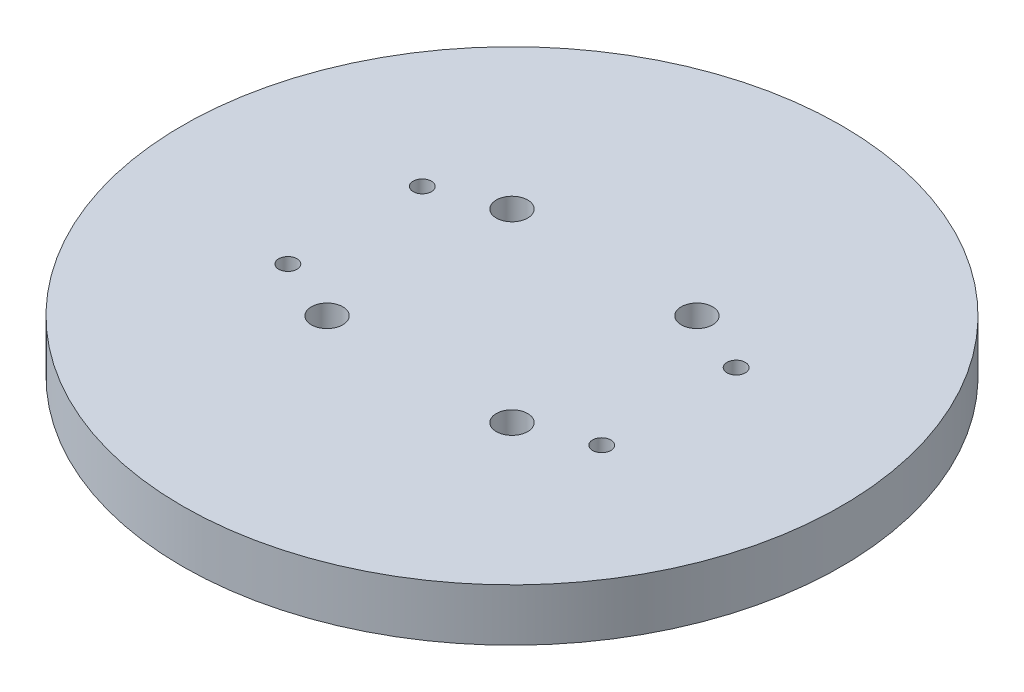
ISO-10303-21;
HEADER;
FILE_DESCRIPTION(('STEP AP214'),'2;1');
FILE_NAME('part.step','',(''),(''),'','','');
FILE_SCHEMA(('AUTOMOTIVE_DESIGN { 1 0 10303 214 1 1 1 1 }'));
ENDSEC;
DATA;
#1=APPLICATION_CONTEXT('core data for automotive mechanical design processes');
#2=APPLICATION_PROTOCOL_DEFINITION('international standard','automotive_design',2000,#1);
#3=PRODUCT_CONTEXT('',#1,'mechanical');
#4=PRODUCT('Part','Part','',(#3));
#5=PRODUCT_RELATED_PRODUCT_CATEGORY('part','',(#4));
#6=PRODUCT_DEFINITION_FORMATION('','',#4);
#7=PRODUCT_DEFINITION_CONTEXT('part definition',#1,'design');
#8=PRODUCT_DEFINITION('design','',#6,#7);
#9=PRODUCT_DEFINITION_SHAPE('','',#8);
#10=(LENGTH_UNIT() NAMED_UNIT(*) SI_UNIT(.MILLI.,.METRE.));
#11=(NAMED_UNIT(*) PLANE_ANGLE_UNIT() SI_UNIT($,.RADIAN.));
#12=(NAMED_UNIT(*) SI_UNIT($,.STERADIAN.) SOLID_ANGLE_UNIT());
#13=UNCERTAINTY_MEASURE_WITH_UNIT(LENGTH_MEASURE(1.E-05),#10,'distance_accuracy_value','');
#14=(GEOMETRIC_REPRESENTATION_CONTEXT(3) GLOBAL_UNCERTAINTY_ASSIGNED_CONTEXT((#13)) GLOBAL_UNIT_ASSIGNED_CONTEXT((#10,
#11,#12)) REPRESENTATION_CONTEXT('',''));
#15=CARTESIAN_POINT('',(0.,0.,0.));
#16=DIRECTION('',(0.,0.,1.));
#17=DIRECTION('',(1.,0.,0.));
#18=AXIS2_PLACEMENT_3D('',#15,#16,#17);
#19=CARTESIAN_POINT('',(0.,0.,-43.));
#20=DIRECTION('',(0.,1.,0.));
#21=DIRECTION('',(0.,0.,1.));
#22=AXIS2_PLACEMENT_3D('',#19,#20,#21);
#23=PLANE('',#22);
#24=CARTESIAN_POINT('',(17.6776695296638,0.,2.32233047033646));
#25=DIRECTION('',(0.,1.,0.));
#26=DIRECTION('',(0.,0.,1.));
#27=AXIS2_PLACEMENT_3D('',#24,#25,#26);
#28=CIRCLE('',#27,3.);
#29=CARTESIAN_POINT('',(17.6776695296638,0.,5.32233047033646));
#30=VERTEX_POINT('',#29);
#31=EDGE_CURVE('E222',#30,#30,#28,.T.);
#32=ORIENTED_EDGE('',*,*,#31,.F.);
#33=EDGE_LOOP('',(#32));
#34=FACE_BOUND('',#33,.T.);
#35=CARTESIAN_POINT('',(-17.6776695296636,0.,2.32233047033621));
#36=DIRECTION('',(0.,1.,0.));
#37=DIRECTION('',(0.,0.,1.));
#38=AXIS2_PLACEMENT_3D('',#35,#36,#37);
#39=CIRCLE('',#38,3.);
#40=CARTESIAN_POINT('',(-17.6776695296636,0.,5.32233047033621));
#41=VERTEX_POINT('',#40);
#42=EDGE_CURVE('E225',#41,#41,#39,.T.);
#43=ORIENTED_EDGE('',*,*,#42,.F.);
#44=EDGE_LOOP('',(#43));
#45=FACE_BOUND('',#44,.T.);
#46=CARTESIAN_POINT('',(-17.6776695296637,0.,37.6776695296637));
#47=DIRECTION('',(0.,1.,0.));
#48=DIRECTION('',(0.,0.,1.));
#49=AXIS2_PLACEMENT_3D('',#46,#47,#48);
#50=CIRCLE('',#49,3.);
#51=CARTESIAN_POINT('',(-17.6776695296637,0.,40.6776695296637));
#52=VERTEX_POINT('',#51);
#53=EDGE_CURVE('E87',#52,#52,#50,.T.);
#54=ORIENTED_EDGE('',*,*,#53,.F.);
#55=EDGE_LOOP('',(#54));
#56=FACE_BOUND('',#55,.T.);
#57=CARTESIAN_POINT('',(17.6776695296637,0.,37.6776695296637));
#58=DIRECTION('',(0.,1.,0.));
#59=DIRECTION('',(0.,0.,1.));
#60=AXIS2_PLACEMENT_3D('',#57,#58,#59);
#61=CIRCLE('',#60,3.);
#62=CARTESIAN_POINT('',(17.6776695296637,0.,40.6776695296637));
#63=VERTEX_POINT('',#62);
#64=EDGE_CURVE('E82',#63,#63,#61,.T.);
#65=ORIENTED_EDGE('',*,*,#64,.F.);
#66=EDGE_LOOP('',(#65));
#67=FACE_BOUND('',#66,.T.);
#68=CARTESIAN_POINT('',(-30.,0.,32.85));
#69=DIRECTION('',(0.,1.,0.));
#70=DIRECTION('',(0.,0.,1.));
#71=AXIS2_PLACEMENT_3D('',#68,#69,#70);
#72=CIRCLE('',#71,1.75);
#73=CARTESIAN_POINT('',(-30.,0.,34.6));
#74=VERTEX_POINT('',#73);
#75=EDGE_CURVE('E68',#74,#74,#72,.F.);
#76=ORIENTED_EDGE('',*,*,#75,.T.);
#77=EDGE_LOOP('',(#76));
#78=FACE_BOUND('',#77,.T.);
#79=CARTESIAN_POINT('',(30.,0.,7.15));
#80=DIRECTION('',(0.,1.,0.));
#81=DIRECTION('',(0.,0.,1.));
#82=AXIS2_PLACEMENT_3D('',#79,#80,#81);
#83=CIRCLE('',#82,1.75);
#84=CARTESIAN_POINT('',(30.,0.,8.9));
#85=VERTEX_POINT('',#84);
#86=EDGE_CURVE('E73',#85,#85,#83,.F.);
#87=ORIENTED_EDGE('',*,*,#86,.T.);
#88=EDGE_LOOP('',(#87));
#89=FACE_BOUND('',#88,.T.);
#90=CARTESIAN_POINT('',(-30.,0.,7.15));
#91=DIRECTION('',(0.,1.,0.));
#92=DIRECTION('',(0.,0.,1.));
#93=AXIS2_PLACEMENT_3D('',#90,#91,#92);
#94=CIRCLE('',#93,1.75);
#95=CARTESIAN_POINT('',(-30.,0.,8.9));
#96=VERTEX_POINT('',#95);
#97=EDGE_CURVE('E47',#96,#96,#94,.F.);
#98=ORIENTED_EDGE('',*,*,#97,.T.);
#99=EDGE_LOOP('',(#98));
#100=FACE_BOUND('',#99,.T.);
#101=CARTESIAN_POINT('',(30.,0.,32.85));
#102=DIRECTION('',(0.,1.,0.));
#103=DIRECTION('',(0.,0.,1.));
#104=AXIS2_PLACEMENT_3D('',#101,#102,#103);
#105=CIRCLE('',#104,1.75);
#106=CARTESIAN_POINT('',(30.,0.,34.6));
#107=VERTEX_POINT('',#106);
#108=EDGE_CURVE('E71',#107,#107,#105,.F.);
#109=ORIENTED_EDGE('',*,*,#108,.T.);
#110=EDGE_LOOP('',(#109));
#111=FACE_BOUND('',#110,.T.);
#112=CARTESIAN_POINT('',(0.,0.,20.));
#113=DIRECTION('',(0.,-1.,0.));
#114=DIRECTION('',(0.,0.,-1.));
#115=AXIS2_PLACEMENT_3D('',#112,#113,#114);
#116=CIRCLE('',#115,63.);
#117=CARTESIAN_POINT('',(0.,0.,-43.));
#118=VERTEX_POINT('',#117);
#119=EDGE_CURVE('E67',#118,#118,#116,.T.);
#120=ORIENTED_EDGE('',*,*,#119,.F.);
#121=EDGE_LOOP('',(#120));
#122=FACE_BOUND('',#121,.T.);
#123=ADVANCED_FACE('F43',(#34,#45,#56,#67,#78,#89,#100,#111,#122),#23,.T.);
#124=CARTESIAN_POINT('',(0.,-10.,20.));
#125=DIRECTION('',(0.,-1.,0.));
#126=DIRECTION('',(0.,0.,-1.));
#127=AXIS2_PLACEMENT_3D('',#124,#125,#126);
#128=PLANE('',#127);
#129=CARTESIAN_POINT('',(17.6776695296638,-10.,2.32233047033646));
#130=DIRECTION('',(0.,1.,0.));
#131=DIRECTION('',(0.,0.,1.));
#132=AXIS2_PLACEMENT_3D('',#129,#130,#131);
#133=CIRCLE('',#132,3.);
#134=CARTESIAN_POINT('',(17.6776695296638,-10.,5.32233047033646));
#135=VERTEX_POINT('',#134);
#136=EDGE_CURVE('E90',#135,#135,#133,.T.);
#137=ORIENTED_EDGE('',*,*,#136,.T.);
#138=EDGE_LOOP('',(#137));
#139=FACE_BOUND('',#138,.T.);
#140=CARTESIAN_POINT('',(-17.6776695296636,-10.,2.32233047033621));
#141=DIRECTION('',(0.,1.,0.));
#142=DIRECTION('',(0.,0.,1.));
#143=AXIS2_PLACEMENT_3D('',#140,#141,#142);
#144=CIRCLE('',#143,3.);
#145=CARTESIAN_POINT('',(-17.6776695296636,-10.,5.32233047033621));
#146=VERTEX_POINT('',#145);
#147=EDGE_CURVE('E223',#146,#146,#144,.T.);
#148=ORIENTED_EDGE('',*,*,#147,.T.);
#149=EDGE_LOOP('',(#148));
#150=FACE_BOUND('',#149,.T.);
#151=CARTESIAN_POINT('',(-17.6776695296637,-10.,37.6776695296637));
#152=DIRECTION('',(0.,1.,0.));
#153=DIRECTION('',(0.,0.,1.));
#154=AXIS2_PLACEMENT_3D('',#151,#152,#153);
#155=CIRCLE('',#154,3.);
#156=CARTESIAN_POINT('',(-17.6776695296637,-10.,40.6776695296637));
#157=VERTEX_POINT('',#156);
#158=EDGE_CURVE('E230',#157,#157,#155,.T.);
#159=ORIENTED_EDGE('',*,*,#158,.T.);
#160=EDGE_LOOP('',(#159));
#161=FACE_BOUND('',#160,.T.);
#162=CARTESIAN_POINT('',(17.6776695296637,-10.,37.6776695296637));
#163=DIRECTION('',(0.,1.,0.));
#164=DIRECTION('',(0.,0.,1.));
#165=AXIS2_PLACEMENT_3D('',#162,#163,#164);
#166=CIRCLE('',#165,3.);
#167=CARTESIAN_POINT('',(17.6776695296637,-10.,40.6776695296637));
#168=VERTEX_POINT('',#167);
#169=EDGE_CURVE('E78',#168,#168,#166,.T.);
#170=ORIENTED_EDGE('',*,*,#169,.T.);
#171=EDGE_LOOP('',(#170));
#172=FACE_BOUND('',#171,.T.);
#173=CARTESIAN_POINT('',(-30.,-10.,7.15));
#174=DIRECTION('',(0.,-1.,0.));
#175=DIRECTION('',(0.,0.,1.));
#176=AXIS2_PLACEMENT_3D('',#173,#174,#175);
#177=CIRCLE('',#176,1.75);
#178=CARTESIAN_POINT('',(-30.,-10.,8.9));
#179=VERTEX_POINT('',#178);
#180=EDGE_CURVE('E10',#179,#179,#177,.T.);
#181=ORIENTED_EDGE('',*,*,#180,.F.);
#182=EDGE_LOOP('',(#181));
#183=FACE_BOUND('',#182,.T.);
#184=CARTESIAN_POINT('',(30.,-10.,7.15));
#185=DIRECTION('',(0.,-1.,0.));
#186=DIRECTION('',(0.,0.,-1.));
#187=AXIS2_PLACEMENT_3D('',#184,#185,#186);
#188=CIRCLE('',#187,1.75);
#189=CARTESIAN_POINT('',(30.,-10.,5.39999999999999));
#190=VERTEX_POINT('',#189);
#191=EDGE_CURVE('E51',#190,#190,#188,.T.);
#192=ORIENTED_EDGE('',*,*,#191,.F.);
#193=EDGE_LOOP('',(#192));
#194=FACE_BOUND('',#193,.T.);
#195=CARTESIAN_POINT('',(30.,-10.,32.85));
#196=DIRECTION('',(0.,-1.,0.));
#197=DIRECTION('',(0.,0.,1.));
#198=AXIS2_PLACEMENT_3D('',#195,#196,#197);
#199=CIRCLE('',#198,1.75);
#200=CARTESIAN_POINT('',(30.,-10.,34.6));
#201=VERTEX_POINT('',#200);
#202=EDGE_CURVE('E56',#201,#201,#199,.T.);
#203=ORIENTED_EDGE('',*,*,#202,.F.);
#204=EDGE_LOOP('',(#203));
#205=FACE_BOUND('',#204,.T.);
#206=CARTESIAN_POINT('',(-30.,-10.,32.85));
#207=DIRECTION('',(0.,-1.,0.));
#208=DIRECTION('',(0.,0.,-1.));
#209=AXIS2_PLACEMENT_3D('',#206,#207,#208);
#210=CIRCLE('',#209,1.75);
#211=CARTESIAN_POINT('',(-30.,-10.,31.1));
#212=VERTEX_POINT('',#211);
#213=EDGE_CURVE('E64',#212,#212,#210,.T.);
#214=ORIENTED_EDGE('',*,*,#213,.F.);
#215=EDGE_LOOP('',(#214));
#216=FACE_BOUND('',#215,.T.);
#217=CARTESIAN_POINT('',(0.,-10.,20.));
#218=DIRECTION('',(0.,-1.,0.));
#219=DIRECTION('',(0.,0.,-1.));
#220=AXIS2_PLACEMENT_3D('',#217,#218,#219);
#221=CIRCLE('',#220,63.);
#222=CARTESIAN_POINT('',(0.,-10.,-43.));
#223=VERTEX_POINT('',#222);
#224=EDGE_CURVE('E59',#223,#223,#221,.T.);
#225=ORIENTED_EDGE('',*,*,#224,.T.);
#226=EDGE_LOOP('',(#225));
#227=FACE_BOUND('',#226,.T.);
#228=ADVANCED_FACE('F98',(#139,#150,#161,#172,#183,#194,#205,#216,#227),#128,.T.);
#229=CARTESIAN_POINT('',(0.,-10.,20.));
#230=DIRECTION('',(0.,1.,0.));
#231=DIRECTION('',(0.,0.,1.));
#232=AXIS2_PLACEMENT_3D('',#229,#230,#231);
#233=CYLINDRICAL_SURFACE('',#232,63.);
#234=ORIENTED_EDGE('',*,*,#224,.F.);
#235=EDGE_LOOP('',(#234));
#236=FACE_BOUND('',#235,.T.);
#237=ORIENTED_EDGE('',*,*,#119,.T.);
#238=EDGE_LOOP('',(#237));
#239=FACE_BOUND('',#238,.T.);
#240=ADVANCED_FACE('F100',(#236,#239),#233,.T.);
#241=CARTESIAN_POINT('',(-30.,14.307738994866,32.85));
#242=DIRECTION('',(0.,-1.,0.));
#243=DIRECTION('',(0.,0.,-1.));
#244=AXIS2_PLACEMENT_3D('',#241,#242,#243);
#245=CYLINDRICAL_SURFACE('',#244,1.75);
#246=ORIENTED_EDGE('',*,*,#213,.T.);
#247=EDGE_LOOP('',(#246));
#248=FACE_BOUND('',#247,.T.);
#249=ORIENTED_EDGE('',*,*,#75,.F.);
#250=EDGE_LOOP('',(#249));
#251=FACE_BOUND('',#250,.T.);
#252=ADVANCED_FACE('F45',(#248,#251),#245,.F.);
#253=CARTESIAN_POINT('',(30.,14.307738994866,32.85));
#254=DIRECTION('',(0.,-1.,0.));
#255=DIRECTION('',(0.,0.,-1.));
#256=AXIS2_PLACEMENT_3D('',#253,#254,#255);
#257=CYLINDRICAL_SURFACE('',#256,1.75);
#258=ORIENTED_EDGE('',*,*,#202,.T.);
#259=EDGE_LOOP('',(#258));
#260=FACE_BOUND('',#259,.T.);
#261=ORIENTED_EDGE('',*,*,#108,.F.);
#262=EDGE_LOOP('',(#261));
#263=FACE_BOUND('',#262,.T.);
#264=ADVANCED_FACE('F106',(#260,#263),#257,.F.);
#265=CARTESIAN_POINT('',(30.,14.307738994866,7.15));
#266=DIRECTION('',(0.,-1.,0.));
#267=DIRECTION('',(0.,0.,-1.));
#268=AXIS2_PLACEMENT_3D('',#265,#266,#267);
#269=CYLINDRICAL_SURFACE('',#268,1.75);
#270=ORIENTED_EDGE('',*,*,#191,.T.);
#271=EDGE_LOOP('',(#270));
#272=FACE_BOUND('',#271,.T.);
#273=ORIENTED_EDGE('',*,*,#86,.F.);
#274=EDGE_LOOP('',(#273));
#275=FACE_BOUND('',#274,.T.);
#276=ADVANCED_FACE('F121',(#272,#275),#269,.F.);
#277=CARTESIAN_POINT('',(-30.,14.307738994866,7.15));
#278=DIRECTION('',(0.,-1.,0.));
#279=DIRECTION('',(0.,0.,-1.));
#280=AXIS2_PLACEMENT_3D('',#277,#278,#279);
#281=CYLINDRICAL_SURFACE('',#280,1.75);
#282=ORIENTED_EDGE('',*,*,#180,.T.);
#283=EDGE_LOOP('',(#282));
#284=FACE_BOUND('',#283,.T.);
#285=ORIENTED_EDGE('',*,*,#97,.F.);
#286=EDGE_LOOP('',(#285));
#287=FACE_BOUND('',#286,.T.);
#288=ADVANCED_FACE('F118',(#284,#287),#281,.F.);
#289=CARTESIAN_POINT('',(17.6776695296637,-10.,37.6776695296637));
#290=DIRECTION('',(0.,1.,0.));
#291=DIRECTION('',(0.,0.,1.));
#292=AXIS2_PLACEMENT_3D('',#289,#290,#291);
#293=CYLINDRICAL_SURFACE('',#292,3.);
#294=ORIENTED_EDGE('',*,*,#169,.F.);
#295=EDGE_LOOP('',(#294));
#296=FACE_BOUND('',#295,.T.);
#297=ORIENTED_EDGE('',*,*,#64,.T.);
#298=EDGE_LOOP('',(#297));
#299=FACE_BOUND('',#298,.T.);
#300=ADVANCED_FACE('F112',(#296,#299),#293,.F.);
#301=CARTESIAN_POINT('',(-17.6776695296637,-10.,37.6776695296637));
#302=DIRECTION('',(0.,1.,0.));
#303=DIRECTION('',(0.,0.,1.));
#304=AXIS2_PLACEMENT_3D('',#301,#302,#303);
#305=CYLINDRICAL_SURFACE('',#304,3.);
#306=ORIENTED_EDGE('',*,*,#158,.F.);
#307=EDGE_LOOP('',(#306));
#308=FACE_BOUND('',#307,.T.);
#309=ORIENTED_EDGE('',*,*,#53,.T.);
#310=EDGE_LOOP('',(#309));
#311=FACE_BOUND('',#310,.T.);
#312=ADVANCED_FACE('F168',(#308,#311),#305,.F.);
#313=CARTESIAN_POINT('',(-17.6776695296636,-10.,2.32233047033621));
#314=DIRECTION('',(0.,1.,0.));
#315=DIRECTION('',(0.,0.,1.));
#316=AXIS2_PLACEMENT_3D('',#313,#314,#315);
#317=CYLINDRICAL_SURFACE('',#316,3.);
#318=ORIENTED_EDGE('',*,*,#147,.F.);
#319=EDGE_LOOP('',(#318));
#320=FACE_BOUND('',#319,.T.);
#321=ORIENTED_EDGE('',*,*,#42,.T.);
#322=EDGE_LOOP('',(#321));
#323=FACE_BOUND('',#322,.T.);
#324=ADVANCED_FACE('F176',(#320,#323),#317,.F.);
#325=CARTESIAN_POINT('',(17.6776695296638,-10.,2.32233047033646));
#326=DIRECTION('',(0.,1.,0.));
#327=DIRECTION('',(0.,0.,1.));
#328=AXIS2_PLACEMENT_3D('',#325,#326,#327);
#329=CYLINDRICAL_SURFACE('',#328,3.);
#330=ORIENTED_EDGE('',*,*,#136,.F.);
#331=EDGE_LOOP('',(#330));
#332=FACE_BOUND('',#331,.T.);
#333=ORIENTED_EDGE('',*,*,#31,.T.);
#334=EDGE_LOOP('',(#333));
#335=FACE_BOUND('',#334,.T.);
#336=ADVANCED_FACE('F185',(#332,#335),#329,.F.);
#337=CLOSED_SHELL('',(#123,#228,#240,#252,#264,#276,#288,#300,#312,#324,#336));
#338=MANIFOLD_SOLID_BREP('B2',#337);
#339=ADVANCED_BREP_SHAPE_REPRESENTATION('',(#18,#338),#14);
#340=SHAPE_DEFINITION_REPRESENTATION(#9,#339);
ENDSEC;
END-ISO-10303-21;
